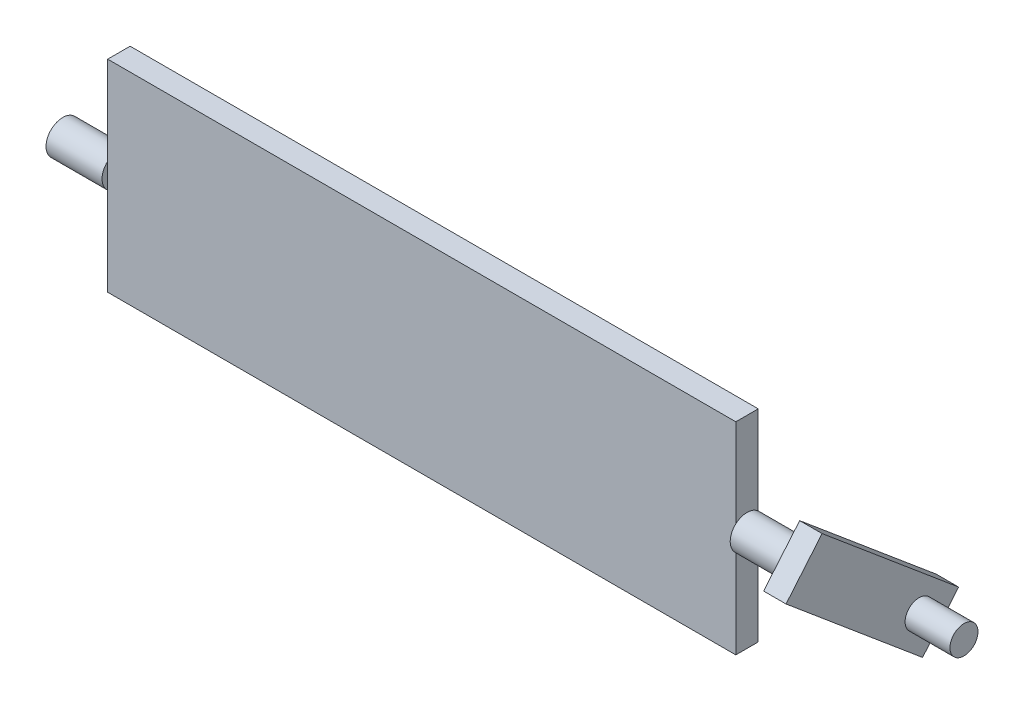
ISO-10303-21;
HEADER;
FILE_DESCRIPTION(('STEP AP214'),'2;1');
FILE_NAME('part.step','',(''),(''),'','','');
FILE_SCHEMA(('AUTOMOTIVE_DESIGN { 1 0 10303 214 1 1 1 1 }'));
ENDSEC;
DATA;
#1=APPLICATION_CONTEXT('core data for automotive mechanical design processes');
#2=APPLICATION_PROTOCOL_DEFINITION('international standard','automotive_design',2000,#1);
#3=PRODUCT_CONTEXT('',#1,'mechanical');
#4=PRODUCT('Part','Part','',(#3));
#5=PRODUCT_RELATED_PRODUCT_CATEGORY('part','',(#4));
#6=PRODUCT_DEFINITION_FORMATION('','',#4);
#7=PRODUCT_DEFINITION_CONTEXT('part definition',#1,'design');
#8=PRODUCT_DEFINITION('design','',#6,#7);
#9=PRODUCT_DEFINITION_SHAPE('','',#8);
#10=(LENGTH_UNIT() NAMED_UNIT(*) SI_UNIT(.MILLI.,.METRE.));
#11=(NAMED_UNIT(*) PLANE_ANGLE_UNIT() SI_UNIT($,.RADIAN.));
#12=(NAMED_UNIT(*) SI_UNIT($,.STERADIAN.) SOLID_ANGLE_UNIT());
#13=UNCERTAINTY_MEASURE_WITH_UNIT(LENGTH_MEASURE(1.E-05),#10,'distance_accuracy_value','');
#14=(GEOMETRIC_REPRESENTATION_CONTEXT(3) GLOBAL_UNCERTAINTY_ASSIGNED_CONTEXT((#13)) GLOBAL_UNIT_ASSIGNED_CONTEXT((#10,
#11,#12)) REPRESENTATION_CONTEXT('',''));
#15=CARTESIAN_POINT('',(0.,0.,0.));
#16=DIRECTION('',(0.,0.,1.));
#17=DIRECTION('',(1.,0.,0.));
#18=AXIS2_PLACEMENT_3D('',#15,#16,#17);
#19=CARTESIAN_POINT('',(28.,-9.,1.));
#20=DIRECTION('',(-1.,0.,0.));
#21=DIRECTION('',(0.,0.,1.));
#22=AXIS2_PLACEMENT_3D('',#19,#20,#21);
#23=PLANE('',#22);
#24=CARTESIAN_POINT('',(28.,0.,0.));
#25=DIRECTION('',(1.,0.,0.));
#26=DIRECTION('',(0.,0.,-1.));
#27=AXIS2_PLACEMENT_3D('',#24,#25,#26);
#28=CIRCLE('',#27,1.5);
#29=CARTESIAN_POINT('',(28.,1.11803398874989,-1.));
#30=VERTEX_POINT('',#29);
#31=CARTESIAN_POINT('',(28.,1.11803398874989,1.));
#32=VERTEX_POINT('',#31);
#33=EDGE_CURVE('E50',#30,#32,#28,.T.);
#34=ORIENTED_EDGE('',*,*,#33,.F.);
#35=DIRECTION('',(0.,1.,0.));
#36=VECTOR('',#35,1.);
#37=CARTESIAN_POINT('',(28.,-9.,-1.));
#38=LINE('',#37,#36);
#39=CARTESIAN_POINT('',(28.,9.,-1.));
#40=VERTEX_POINT('',#39);
#41=EDGE_CURVE('E171',#30,#40,#38,.T.);
#42=ORIENTED_EDGE('',*,*,#41,.T.);
#43=DIRECTION('',(0.,0.,-1.));
#44=VECTOR('',#43,1.);
#45=CARTESIAN_POINT('',(28.,9.,1.));
#46=LINE('',#45,#44);
#47=CARTESIAN_POINT('',(28.,9.,1.));
#48=VERTEX_POINT('',#47);
#49=EDGE_CURVE('E43',#48,#40,#46,.T.);
#50=ORIENTED_EDGE('',*,*,#49,.F.);
#51=DIRECTION('',(0.,1.,0.));
#52=VECTOR('',#51,1.);
#53=CARTESIAN_POINT('',(28.,-9.,1.));
#54=LINE('',#53,#52);
#55=EDGE_CURVE('E58',#32,#48,#54,.T.);
#56=ORIENTED_EDGE('',*,*,#55,.F.);
#57=EDGE_LOOP('',(#34,#42,#50,#56));
#58=FACE_BOUND('',#57,.T.);
#59=ADVANCED_FACE('F39',(#58),#23,.F.);
#60=CARTESIAN_POINT('',(-28.,-9.,1.));
#61=DIRECTION('',(1.,0.,0.));
#62=DIRECTION('',(0.,0.,-1.));
#63=AXIS2_PLACEMENT_3D('',#60,#61,#62);
#64=PLANE('',#63);
#65=CARTESIAN_POINT('',(-28.,0.,0.));
#66=DIRECTION('',(-1.,0.,0.));
#67=DIRECTION('',(0.,0.,1.));
#68=AXIS2_PLACEMENT_3D('',#65,#66,#67);
#69=CIRCLE('',#68,1.5);
#70=CARTESIAN_POINT('',(-28.,1.11803398874989,1.));
#71=VERTEX_POINT('',#70);
#72=CARTESIAN_POINT('',(-28.,1.11803398874989,-1.));
#73=VERTEX_POINT('',#72);
#74=EDGE_CURVE('E172',#71,#73,#69,.T.);
#75=ORIENTED_EDGE('',*,*,#74,.F.);
#76=DIRECTION('',(0.,-1.,0.));
#77=VECTOR('',#76,1.);
#78=CARTESIAN_POINT('',(-28.,-9.,1.));
#79=LINE('',#78,#77);
#80=CARTESIAN_POINT('',(-28.,9.,1.));
#81=VERTEX_POINT('',#80);
#82=EDGE_CURVE('E182',#81,#71,#79,.T.);
#83=ORIENTED_EDGE('',*,*,#82,.F.);
#84=DIRECTION('',(0.,0.,-1.));
#85=VECTOR('',#84,1.);
#86=CARTESIAN_POINT('',(-28.,9.,1.));
#87=LINE('',#86,#85);
#88=CARTESIAN_POINT('',(-28.,9.,-1.));
#89=VERTEX_POINT('',#88);
#90=EDGE_CURVE('E205',#81,#89,#87,.T.);
#91=ORIENTED_EDGE('',*,*,#90,.T.);
#92=DIRECTION('',(0.,-1.,0.));
#93=VECTOR('',#92,1.);
#94=CARTESIAN_POINT('',(-28.,-9.,-1.));
#95=LINE('',#94,#93);
#96=EDGE_CURVE('E195',#89,#73,#95,.T.);
#97=ORIENTED_EDGE('',*,*,#96,.T.);
#98=EDGE_LOOP('',(#75,#83,#91,#97));
#99=FACE_BOUND('',#98,.T.);
#100=ADVANCED_FACE('F268',(#99),#64,.F.);
#101=CARTESIAN_POINT('',(28.,-1.11803398874989,1.));
#102=VERTEX_POINT('',#101);
#103=CARTESIAN_POINT('',(28.,-1.11803398874989,-1.));
#104=VERTEX_POINT('',#103);
#105=EDGE_CURVE('E11',#102,#104,#28,.T.);
#106=ORIENTED_EDGE('',*,*,#105,.F.);
#107=CARTESIAN_POINT('',(28.,-9.,1.));
#108=VERTEX_POINT('',#107);
#109=EDGE_CURVE('E176',#108,#102,#54,.T.);
#110=ORIENTED_EDGE('',*,*,#109,.F.);
#111=DIRECTION('',(0.,0.,-1.));
#112=VECTOR('',#111,1.);
#113=CARTESIAN_POINT('',(28.,-9.,1.));
#114=LINE('',#113,#112);
#115=CARTESIAN_POINT('',(28.,-9.,-1.));
#116=VERTEX_POINT('',#115);
#117=EDGE_CURVE('E188',#108,#116,#114,.T.);
#118=ORIENTED_EDGE('',*,*,#117,.T.);
#119=EDGE_CURVE('E189',#116,#104,#38,.T.);
#120=ORIENTED_EDGE('',*,*,#119,.T.);
#121=EDGE_LOOP('',(#106,#110,#118,#120));
#122=FACE_BOUND('',#121,.T.);
#123=ADVANCED_FACE('F41',(#122),#23,.F.);
#124=CARTESIAN_POINT('',(-28.,9.,1.));
#125=DIRECTION('',(0.,-1.,0.));
#126=DIRECTION('',(0.,0.,-1.));
#127=AXIS2_PLACEMENT_3D('',#124,#125,#126);
#128=PLANE('',#127);
#129=DIRECTION('',(-1.,0.,0.));
#130=VECTOR('',#129,1.);
#131=CARTESIAN_POINT('',(-28.,9.,-1.));
#132=LINE('',#131,#130);
#133=EDGE_CURVE('E191',#40,#89,#132,.T.);
#134=ORIENTED_EDGE('',*,*,#133,.T.);
#135=ORIENTED_EDGE('',*,*,#90,.F.);
#136=DIRECTION('',(-1.,0.,0.));
#137=VECTOR('',#136,1.);
#138=CARTESIAN_POINT('',(-28.,9.,1.));
#139=LINE('',#138,#137);
#140=EDGE_CURVE('E178',#48,#81,#139,.T.);
#141=ORIENTED_EDGE('',*,*,#140,.F.);
#142=ORIENTED_EDGE('',*,*,#49,.T.);
#143=EDGE_LOOP('',(#134,#135,#141,#142));
#144=FACE_BOUND('',#143,.T.);
#145=ADVANCED_FACE('F274',(#144),#128,.F.);
#146=CARTESIAN_POINT('',(-28.,-1.11803398874989,-1.));
#147=VERTEX_POINT('',#146);
#148=CARTESIAN_POINT('',(-28.,-1.11803398874989,1.));
#149=VERTEX_POINT('',#148);
#150=EDGE_CURVE('E48',#147,#149,#69,.T.);
#151=ORIENTED_EDGE('',*,*,#150,.F.);
#152=CARTESIAN_POINT('',(-28.,-9.,-1.));
#153=VERTEX_POINT('',#152);
#154=EDGE_CURVE('E194',#147,#153,#95,.T.);
#155=ORIENTED_EDGE('',*,*,#154,.T.);
#156=DIRECTION('',(0.,0.,-1.));
#157=VECTOR('',#156,1.);
#158=CARTESIAN_POINT('',(-28.,-9.,1.));
#159=LINE('',#158,#157);
#160=CARTESIAN_POINT('',(-28.,-9.,1.));
#161=VERTEX_POINT('',#160);
#162=EDGE_CURVE('E203',#161,#153,#159,.T.);
#163=ORIENTED_EDGE('',*,*,#162,.F.);
#164=EDGE_CURVE('E181',#149,#161,#79,.T.);
#165=ORIENTED_EDGE('',*,*,#164,.F.);
#166=EDGE_LOOP('',(#151,#155,#163,#165));
#167=FACE_BOUND('',#166,.T.);
#168=ADVANCED_FACE('F231',(#167),#64,.F.);
#169=CARTESIAN_POINT('',(-28.,-9.,1.));
#170=DIRECTION('',(0.,1.,0.));
#171=DIRECTION('',(0.,0.,1.));
#172=AXIS2_PLACEMENT_3D('',#169,#170,#171);
#173=PLANE('',#172);
#174=DIRECTION('',(1.,0.,0.));
#175=VECTOR('',#174,1.);
#176=CARTESIAN_POINT('',(-28.,-9.,-1.));
#177=LINE('',#176,#175);
#178=EDGE_CURVE('E198',#153,#116,#177,.T.);
#179=ORIENTED_EDGE('',*,*,#178,.T.);
#180=ORIENTED_EDGE('',*,*,#117,.F.);
#181=DIRECTION('',(1.,0.,0.));
#182=VECTOR('',#181,1.);
#183=CARTESIAN_POINT('',(-28.,-9.,1.));
#184=LINE('',#183,#182);
#185=EDGE_CURVE('E185',#161,#108,#184,.T.);
#186=ORIENTED_EDGE('',*,*,#185,.F.);
#187=ORIENTED_EDGE('',*,*,#162,.T.);
#188=EDGE_LOOP('',(#179,#180,#186,#187));
#189=FACE_BOUND('',#188,.T.);
#190=ADVANCED_FACE('F235',(#189),#173,.F.);
#191=CARTESIAN_POINT('',(0.,0.,1.));
#192=DIRECTION('',(0.,0.,-1.));
#193=DIRECTION('',(-1.,0.,0.));
#194=AXIS2_PLACEMENT_3D('',#191,#192,#193);
#195=PLANE('',#194);
#196=ORIENTED_EDGE('',*,*,#109,.T.);
#197=EDGE_CURVE('E179',#102,#32,#54,.T.);
#198=ORIENTED_EDGE('',*,*,#197,.T.);
#199=ORIENTED_EDGE('',*,*,#55,.T.);
#200=ORIENTED_EDGE('',*,*,#140,.T.);
#201=ORIENTED_EDGE('',*,*,#82,.T.);
#202=EDGE_CURVE('E186',#71,#149,#79,.T.);
#203=ORIENTED_EDGE('',*,*,#202,.T.);
#204=ORIENTED_EDGE('',*,*,#164,.T.);
#205=ORIENTED_EDGE('',*,*,#185,.T.);
#206=EDGE_LOOP('',(#196,#198,#199,#200,#201,#203,#204,#205));
#207=FACE_BOUND('',#206,.T.);
#208=ADVANCED_FACE('F227',(#207),#195,.F.);
#209=CARTESIAN_POINT('',(0.,0.,-1.));
#210=DIRECTION('',(0.,0.,-1.));
#211=DIRECTION('',(-1.,0.,0.));
#212=AXIS2_PLACEMENT_3D('',#209,#210,#211);
#213=PLANE('',#212);
#214=ORIENTED_EDGE('',*,*,#119,.F.);
#215=ORIENTED_EDGE('',*,*,#178,.F.);
#216=ORIENTED_EDGE('',*,*,#154,.F.);
#217=EDGE_CURVE('E199',#73,#147,#95,.T.);
#218=ORIENTED_EDGE('',*,*,#217,.F.);
#219=ORIENTED_EDGE('',*,*,#96,.F.);
#220=ORIENTED_EDGE('',*,*,#133,.F.);
#221=ORIENTED_EDGE('',*,*,#41,.F.);
#222=EDGE_CURVE('E192',#104,#30,#38,.T.);
#223=ORIENTED_EDGE('',*,*,#222,.F.);
#224=EDGE_LOOP('',(#214,#215,#216,#218,#219,#220,#221,#223));
#225=FACE_BOUND('',#224,.T.);
#226=ADVANCED_FACE('F250',(#225),#213,.T.);
#227=CARTESIAN_POINT('',(-28.,0.,0.));
#228=DIRECTION('',(-1.,0.,0.));
#229=DIRECTION('',(0.,0.,1.));
#230=AXIS2_PLACEMENT_3D('',#227,#228,#229);
#231=PLANE('',#230);
#232=EDGE_CURVE('E175',#73,#147,#69,.T.);
#233=ORIENTED_EDGE('',*,*,#232,.F.);
#234=ORIENTED_EDGE('',*,*,#217,.T.);
#235=EDGE_LOOP('',(#233,#234));
#236=FACE_BOUND('',#235,.T.);
#237=ADVANCED_FACE('F264',(#236),#231,.F.);
#238=CARTESIAN_POINT('',(-33.,0.,0.));
#239=DIRECTION('',(1.,0.,0.));
#240=DIRECTION('',(0.,0.,-1.));
#241=AXIS2_PLACEMENT_3D('',#238,#239,#240);
#242=CYLINDRICAL_SURFACE('',#241,1.5);
#243=CARTESIAN_POINT('',(-33.,0.,0.));
#244=DIRECTION('',(-1.,0.,0.));
#245=DIRECTION('',(0.,0.,1.));
#246=AXIS2_PLACEMENT_3D('',#243,#244,#245);
#247=CIRCLE('',#246,1.5);
#248=CARTESIAN_POINT('',(-33.,0.,1.5));
#249=VERTEX_POINT('',#248);
#250=EDGE_CURVE('E168',#249,#249,#247,.T.);
#251=ORIENTED_EDGE('',*,*,#250,.F.);
#252=EDGE_LOOP('',(#251));
#253=FACE_BOUND('',#252,.T.);
#254=ORIENTED_EDGE('',*,*,#74,.T.);
#255=ORIENTED_EDGE('',*,*,#232,.T.);
#256=ORIENTED_EDGE('',*,*,#150,.T.);
#257=EDGE_CURVE('E165',#149,#71,#69,.T.);
#258=ORIENTED_EDGE('',*,*,#257,.T.);
#259=EDGE_LOOP('',(#254,#255,#256,#258));
#260=FACE_BOUND('',#259,.T.);
#261=ADVANCED_FACE('F220',(#253,#260),#242,.T.);
#262=CARTESIAN_POINT('',(-33.,0.,0.));
#263=DIRECTION('',(-1.,0.,0.));
#264=DIRECTION('',(0.,0.,1.));
#265=AXIS2_PLACEMENT_3D('',#262,#263,#264);
#266=PLANE('',#265);
#267=ORIENTED_EDGE('',*,*,#250,.T.);
#268=EDGE_LOOP('',(#267));
#269=FACE_BOUND('',#268,.T.);
#270=ADVANCED_FACE('F262',(#269),#266,.T.);
#271=ORIENTED_EDGE('',*,*,#202,.F.);
#272=ORIENTED_EDGE('',*,*,#257,.F.);
#273=EDGE_LOOP('',(#271,#272));
#274=FACE_BOUND('',#273,.T.);
#275=ADVANCED_FACE('F223',(#274),#231,.F.);
#276=CARTESIAN_POINT('',(28.,0.,0.));
#277=DIRECTION('',(1.,0.,0.));
#278=DIRECTION('',(0.,0.,-1.));
#279=AXIS2_PLACEMENT_3D('',#276,#277,#278);
#280=PLANE('',#279);
#281=EDGE_CURVE('E156',#104,#30,#28,.T.);
#282=ORIENTED_EDGE('',*,*,#281,.F.);
#283=ORIENTED_EDGE('',*,*,#222,.T.);
#284=EDGE_LOOP('',(#282,#283));
#285=FACE_BOUND('',#284,.T.);
#286=ADVANCED_FACE('F252',(#285),#280,.F.);
#287=CARTESIAN_POINT('',(33.,0.,0.));
#288=DIRECTION('',(-1.,0.,0.));
#289=DIRECTION('',(0.,0.,1.));
#290=AXIS2_PLACEMENT_3D('',#287,#288,#289);
#291=CYLINDRICAL_SURFACE('',#290,1.5);
#292=CARTESIAN_POINT('',(33.,0.,0.));
#293=DIRECTION('',(1.,0.,0.));
#294=DIRECTION('',(0.,0.,-1.));
#295=AXIS2_PLACEMENT_3D('',#292,#293,#294);
#296=CIRCLE('',#295,1.5);
#297=CARTESIAN_POINT('',(33.,0.,-1.5));
#298=VERTEX_POINT('',#297);
#299=EDGE_CURVE('E163',#298,#298,#296,.T.);
#300=ORIENTED_EDGE('',*,*,#299,.F.);
#301=EDGE_LOOP('',(#300));
#302=FACE_BOUND('',#301,.T.);
#303=ORIENTED_EDGE('',*,*,#33,.T.);
#304=EDGE_CURVE('E51',#32,#102,#28,.T.);
#305=ORIENTED_EDGE('',*,*,#304,.T.);
#306=ORIENTED_EDGE('',*,*,#105,.T.);
#307=ORIENTED_EDGE('',*,*,#281,.T.);
#308=EDGE_LOOP('',(#303,#305,#306,#307));
#309=FACE_BOUND('',#308,.T.);
#310=ADVANCED_FACE('F243',(#302,#309),#291,.T.);
#311=ORIENTED_EDGE('',*,*,#197,.F.);
#312=ORIENTED_EDGE('',*,*,#304,.F.);
#313=EDGE_LOOP('',(#311,#312));
#314=FACE_BOUND('',#313,.T.);
#315=ADVANCED_FACE('F241',(#314),#280,.F.);
#316=CARTESIAN_POINT('',(35.,3.52208013201379,0.308142083581097));
#317=DIRECTION('',(0.,-0.642787609686539,-0.766044443118978));
#318=DIRECTION('',(0.,0.766044443118978,-0.642787609686539));
#319=AXIS2_PLACEMENT_3D('',#316,#317,#318);
#320=PLANE('',#319);
#321=DIRECTION('',(0.,-0.766044443118978,0.642787609686539));
#322=VECTOR('',#321,1.);
#323=CARTESIAN_POINT('',(33.,3.52208013201379,0.308142083581097));
#324=LINE('',#323,#322);
#325=CARTESIAN_POINT('',(33.,3.52208013201379,0.308142083581097));
#326=VERTEX_POINT('',#325);
#327=CARTESIAN_POINT('',(33.,-0.308142083581097,3.52208013201379));
#328=VERTEX_POINT('',#327);
#329=EDGE_CURVE('E155',#326,#328,#324,.T.);
#330=ORIENTED_EDGE('',*,*,#329,.T.);
#331=DIRECTION('',(-1.,0.,0.));
#332=VECTOR('',#331,1.);
#333=CARTESIAN_POINT('',(35.,-0.308142083581097,3.52208013201379));
#334=LINE('',#333,#332);
#335=CARTESIAN_POINT('',(35.,-0.308142083581097,3.52208013201379));
#336=VERTEX_POINT('',#335);
#337=EDGE_CURVE('E135',#336,#328,#334,.T.);
#338=ORIENTED_EDGE('',*,*,#337,.F.);
#339=DIRECTION('',(0.,-0.766044443118978,0.642787609686539));
#340=VECTOR('',#339,1.);
#341=CARTESIAN_POINT('',(35.,3.52208013201379,0.308142083581097));
#342=LINE('',#341,#340);
#343=CARTESIAN_POINT('',(35.,3.52208013201379,0.308142083581097));
#344=VERTEX_POINT('',#343);
#345=EDGE_CURVE('E142',#344,#336,#342,.T.);
#346=ORIENTED_EDGE('',*,*,#345,.F.);
#347=DIRECTION('',(-1.,0.,0.));
#348=VECTOR('',#347,1.);
#349=CARTESIAN_POINT('',(35.,3.52208013201379,0.308142083581097));
#350=LINE('',#349,#348);
#351=EDGE_CURVE('E412',#344,#326,#350,.T.);
#352=ORIENTED_EDGE('',*,*,#351,.T.);
#353=EDGE_LOOP('',(#330,#338,#346,#352));
#354=FACE_BOUND('',#353,.T.);
#355=ADVANCED_FACE('F153',(#354),#320,.F.);
#356=CARTESIAN_POINT('',(35.,-0.308142083581097,3.52208013201379));
#357=DIRECTION('',(0.,0.766044443118978,-0.642787609686539));
#358=DIRECTION('',(0.,0.642787609686539,0.766044443118978));
#359=AXIS2_PLACEMENT_3D('',#356,#357,#358);
#360=PLANE('',#359);
#361=DIRECTION('',(0.,-0.642787609686539,-0.766044443118978));
#362=VECTOR('',#361,1.);
#363=CARTESIAN_POINT('',(33.,-0.308142083581097,3.52208013201379));
#364=LINE('',#363,#362);
#365=CARTESIAN_POINT('',(33.,-10.5220801320138,-8.65041723174057));
#366=VERTEX_POINT('',#365);
#367=EDGE_CURVE('E406',#328,#366,#364,.T.);
#368=ORIENTED_EDGE('',*,*,#367,.T.);
#369=DIRECTION('',(-1.,0.,0.));
#370=VECTOR('',#369,1.);
#371=CARTESIAN_POINT('',(35.,-10.5220801320138,-8.65041723174057));
#372=LINE('',#371,#370);
#373=CARTESIAN_POINT('',(35.,-10.5220801320138,-8.65041723174057));
#374=VERTEX_POINT('',#373);
#375=EDGE_CURVE('E138',#374,#366,#372,.T.);
#376=ORIENTED_EDGE('',*,*,#375,.F.);
#377=DIRECTION('',(0.,-0.642787609686539,-0.766044443118978));
#378=VECTOR('',#377,1.);
#379=CARTESIAN_POINT('',(35.,-0.308142083581097,3.52208013201379));
#380=LINE('',#379,#378);
#381=EDGE_CURVE('E131',#336,#374,#380,.T.);
#382=ORIENTED_EDGE('',*,*,#381,.F.);
#383=ORIENTED_EDGE('',*,*,#337,.T.);
#384=EDGE_LOOP('',(#368,#376,#382,#383));
#385=FACE_BOUND('',#384,.T.);
#386=ADVANCED_FACE('F133',(#385),#360,.F.);
#387=CARTESIAN_POINT('',(35.,-10.5220801320138,-8.65041723174057));
#388=DIRECTION('',(0.,0.642787609686539,0.766044443118978));
#389=DIRECTION('',(0.,-0.766044443118978,0.642787609686539));
#390=AXIS2_PLACEMENT_3D('',#387,#388,#389);
#391=PLANE('',#390);
#392=DIRECTION('',(0.,0.766044443118978,-0.642787609686539));
#393=VECTOR('',#392,1.);
#394=CARTESIAN_POINT('',(33.,-10.5220801320138,-8.65041723174057));
#395=LINE('',#394,#393);
#396=CARTESIAN_POINT('',(33.,-6.6918579164189,-11.8643552801733));
#397=VERTEX_POINT('',#396);
#398=EDGE_CURVE('E415',#366,#397,#395,.T.);
#399=ORIENTED_EDGE('',*,*,#398,.T.);
#400=DIRECTION('',(-1.,0.,0.));
#401=VECTOR('',#400,1.);
#402=CARTESIAN_POINT('',(35.,-6.6918579164189,-11.8643552801733));
#403=LINE('',#402,#401);
#404=CARTESIAN_POINT('',(35.,-6.6918579164189,-11.8643552801733));
#405=VERTEX_POINT('',#404);
#406=EDGE_CURVE('E159',#405,#397,#403,.T.);
#407=ORIENTED_EDGE('',*,*,#406,.F.);
#408=DIRECTION('',(0.,0.766044443118978,-0.642787609686539));
#409=VECTOR('',#408,1.);
#410=CARTESIAN_POINT('',(35.,-10.5220801320138,-8.65041723174057));
#411=LINE('',#410,#409);
#412=EDGE_CURVE('E141',#374,#405,#411,.T.);
#413=ORIENTED_EDGE('',*,*,#412,.F.);
#414=ORIENTED_EDGE('',*,*,#375,.T.);
#415=EDGE_LOOP('',(#399,#407,#413,#414));
#416=FACE_BOUND('',#415,.T.);
#417=ADVANCED_FACE('F340',(#416),#391,.F.);
#418=CARTESIAN_POINT('',(35.,-6.6918579164189,-11.8643552801733));
#419=DIRECTION('',(0.,-0.766044443118978,0.642787609686539));
#420=DIRECTION('',(0.,-0.642787609686539,-0.766044443118978));
#421=AXIS2_PLACEMENT_3D('',#418,#419,#420);
#422=PLANE('',#421);
#423=DIRECTION('',(0.,0.642787609686539,0.766044443118978));
#424=VECTOR('',#423,1.);
#425=CARTESIAN_POINT('',(33.,-6.6918579164189,-11.8643552801733));
#426=LINE('',#425,#424);
#427=EDGE_CURVE('E151',#397,#326,#426,.T.);
#428=ORIENTED_EDGE('',*,*,#427,.T.);
#429=ORIENTED_EDGE('',*,*,#351,.F.);
#430=DIRECTION('',(0.,0.642787609686539,0.766044443118978));
#431=VECTOR('',#430,1.);
#432=CARTESIAN_POINT('',(35.,-6.6918579164189,-11.8643552801733));
#433=LINE('',#432,#431);
#434=EDGE_CURVE('E147',#405,#344,#433,.T.);
#435=ORIENTED_EDGE('',*,*,#434,.F.);
#436=ORIENTED_EDGE('',*,*,#406,.T.);
#437=EDGE_LOOP('',(#428,#429,#435,#436));
#438=FACE_BOUND('',#437,.T.);
#439=ADVANCED_FACE('F349',(#438),#422,.F.);
#440=CARTESIAN_POINT('',(35.,0.,0.));
#441=DIRECTION('',(1.,0.,0.));
#442=DIRECTION('',(0.,0.,-1.));
#443=AXIS2_PLACEMENT_3D('',#440,#441,#442);
#444=PLANE('',#443);
#445=CARTESIAN_POINT('',(35.,-7.,-8.34227514815947));
#446=DIRECTION('',(1.,0.,0.));
#447=DIRECTION('',(0.,0.,-1.));
#448=AXIS2_PLACEMENT_3D('',#445,#446,#447);
#449=CIRCLE('',#448,1.25);
#450=CARTESIAN_POINT('',(35.,-7.,-9.59227514815947));
#451=VERTEX_POINT('',#450);
#452=EDGE_CURVE('E404',#451,#451,#449,.T.);
#453=ORIENTED_EDGE('',*,*,#452,.F.);
#454=EDGE_LOOP('',(#453));
#455=FACE_BOUND('',#454,.T.);
#456=ORIENTED_EDGE('',*,*,#345,.T.);
#457=ORIENTED_EDGE('',*,*,#381,.T.);
#458=ORIENTED_EDGE('',*,*,#412,.T.);
#459=ORIENTED_EDGE('',*,*,#434,.T.);
#460=EDGE_LOOP('',(#456,#457,#458,#459));
#461=FACE_BOUND('',#460,.T.);
#462=ADVANCED_FACE('F145',(#455,#461),#444,.T.);
#463=CARTESIAN_POINT('',(33.,0.,0.));
#464=DIRECTION('',(1.,0.,0.));
#465=DIRECTION('',(0.,0.,-1.));
#466=AXIS2_PLACEMENT_3D('',#463,#464,#465);
#467=PLANE('',#466);
#468=ORIENTED_EDGE('',*,*,#299,.T.);
#469=EDGE_LOOP('',(#468));
#470=FACE_BOUND('',#469,.T.);
#471=ORIENTED_EDGE('',*,*,#329,.F.);
#472=ORIENTED_EDGE('',*,*,#427,.F.);
#473=ORIENTED_EDGE('',*,*,#398,.F.);
#474=ORIENTED_EDGE('',*,*,#367,.F.);
#475=EDGE_LOOP('',(#471,#472,#473,#474));
#476=FACE_BOUND('',#475,.T.);
#477=ADVANCED_FACE('F369',(#470,#476),#467,.F.);
#478=CARTESIAN_POINT('',(39.,-7.,-8.34227514815947));
#479=DIRECTION('',(-1.,0.,0.));
#480=DIRECTION('',(0.,0.,1.));
#481=AXIS2_PLACEMENT_3D('',#478,#479,#480);
#482=CYLINDRICAL_SURFACE('',#481,1.25);
#483=CARTESIAN_POINT('',(39.,-7.,-8.34227514815947));
#484=DIRECTION('',(1.,0.,0.));
#485=DIRECTION('',(0.,0.,-1.));
#486=AXIS2_PLACEMENT_3D('',#483,#484,#485);
#487=CIRCLE('',#486,1.25);
#488=CARTESIAN_POINT('',(39.,-7.,-9.59227514815947));
#489=VERTEX_POINT('',#488);
#490=EDGE_CURVE('E403',#489,#489,#487,.T.);
#491=ORIENTED_EDGE('',*,*,#490,.F.);
#492=EDGE_LOOP('',(#491));
#493=FACE_BOUND('',#492,.T.);
#494=ORIENTED_EDGE('',*,*,#452,.T.);
#495=EDGE_LOOP('',(#494));
#496=FACE_BOUND('',#495,.T.);
#497=ADVANCED_FACE('F379',(#493,#496),#482,.T.);
#498=CARTESIAN_POINT('',(39.,-7.,-8.34227514815947));
#499=DIRECTION('',(1.,0.,0.));
#500=DIRECTION('',(0.,0.,-1.));
#501=AXIS2_PLACEMENT_3D('',#498,#499,#500);
#502=PLANE('',#501);
#503=ORIENTED_EDGE('',*,*,#490,.T.);
#504=EDGE_LOOP('',(#503));
#505=FACE_BOUND('',#504,.T.);
#506=ADVANCED_FACE('F388',(#505),#502,.T.);
#507=CLOSED_SHELL('',(#59,#100,#123,#145,#168,#190,#208,#226,#237,#261,#270,#275,#286,#310,#315,
#355,#386,#417,#439,#462,#477,#497,#506));
#508=MANIFOLD_SOLID_BREP('B2',#507);
#509=ADVANCED_BREP_SHAPE_REPRESENTATION('',(#18,#508),#14);
#510=SHAPE_DEFINITION_REPRESENTATION(#9,#509);
ENDSEC;
END-ISO-10303-21;
